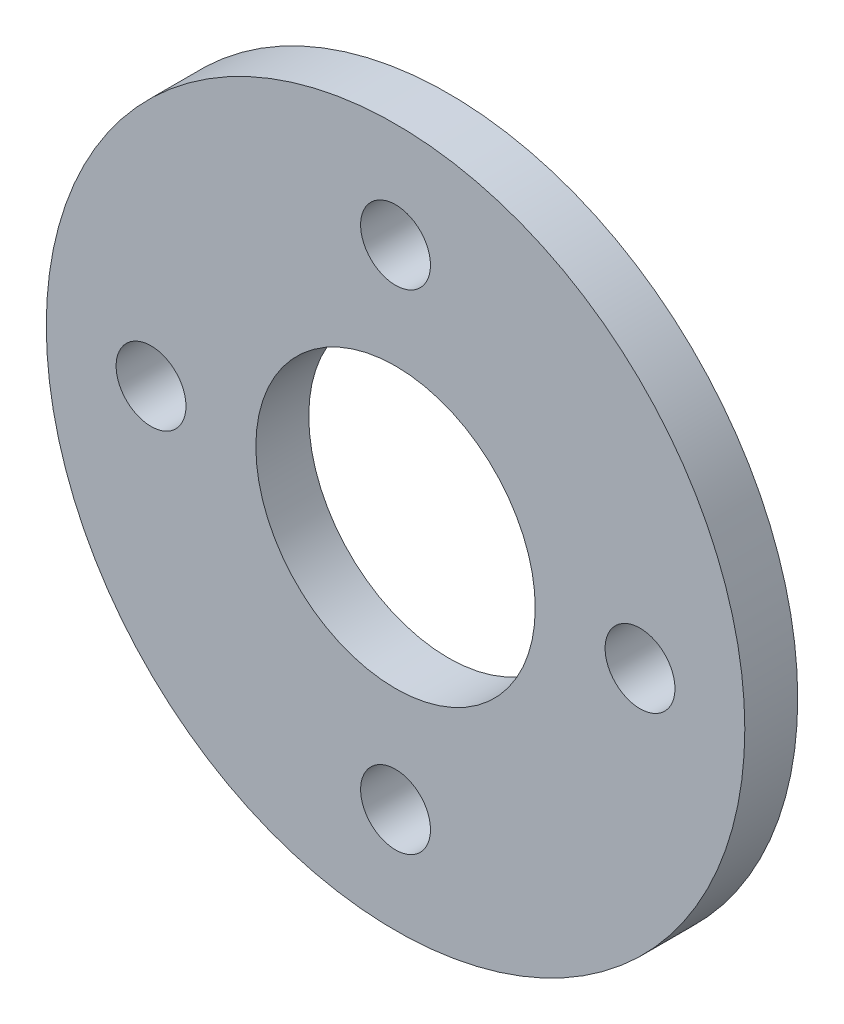
ISO-10303-21;
HEADER;
FILE_DESCRIPTION(('STEP AP214'),'2;1');
FILE_NAME('part.step','',(''),(''),'','','');
FILE_SCHEMA(('AUTOMOTIVE_DESIGN { 1 0 10303 214 1 1 1 1 }'));
ENDSEC;
DATA;
#1=APPLICATION_CONTEXT('core data for automotive mechanical design processes');
#2=APPLICATION_PROTOCOL_DEFINITION('international standard','automotive_design',2000,#1);
#3=PRODUCT_CONTEXT('',#1,'mechanical');
#4=PRODUCT('Part','Part','',(#3));
#5=PRODUCT_RELATED_PRODUCT_CATEGORY('part','',(#4));
#6=PRODUCT_DEFINITION_FORMATION('','',#4);
#7=PRODUCT_DEFINITION_CONTEXT('part definition',#1,'design');
#8=PRODUCT_DEFINITION('design','',#6,#7);
#9=PRODUCT_DEFINITION_SHAPE('','',#8);
#10=(LENGTH_UNIT() NAMED_UNIT(*) SI_UNIT(.MILLI.,.METRE.));
#11=(NAMED_UNIT(*) PLANE_ANGLE_UNIT() SI_UNIT($,.RADIAN.));
#12=(NAMED_UNIT(*) SI_UNIT($,.STERADIAN.) SOLID_ANGLE_UNIT());
#13=UNCERTAINTY_MEASURE_WITH_UNIT(LENGTH_MEASURE(1.E-05),#10,'distance_accuracy_value','');
#14=(GEOMETRIC_REPRESENTATION_CONTEXT(3) GLOBAL_UNCERTAINTY_ASSIGNED_CONTEXT((#13)) GLOBAL_UNIT_ASSIGNED_CONTEXT((#10,
#11,#12)) REPRESENTATION_CONTEXT('',''));
#15=CARTESIAN_POINT('',(0.,0.,0.));
#16=DIRECTION('',(0.,0.,1.));
#17=DIRECTION('',(1.,0.,0.));
#18=AXIS2_PLACEMENT_3D('',#15,#16,#17);
#19=CARTESIAN_POINT('',(0.,0.,1.515));
#20=DIRECTION('',(0.,0.,1.));
#21=DIRECTION('',(1.,0.,0.));
#22=AXIS2_PLACEMENT_3D('',#19,#20,#21);
#23=PLANE('',#22);
#24=CARTESIAN_POINT('',(7.,0.,1.515));
#25=DIRECTION('',(0.,0.,1.));
#26=DIRECTION('',(1.,0.,0.));
#27=AXIS2_PLACEMENT_3D('',#24,#25,#26);
#28=CIRCLE('',#27,0.999999999999999);
#29=CARTESIAN_POINT('',(8.,0.,1.515));
#30=VERTEX_POINT('',#29);
#31=EDGE_CURVE('E72',#30,#30,#28,.T.);
#32=ORIENTED_EDGE('',*,*,#31,.F.);
#33=EDGE_LOOP('',(#32));
#34=FACE_BOUND('',#33,.T.);
#35=CARTESIAN_POINT('',(-7.,0.,1.515));
#36=DIRECTION('',(0.,0.,1.));
#37=DIRECTION('',(1.,0.,0.));
#38=AXIS2_PLACEMENT_3D('',#35,#36,#37);
#39=CIRCLE('',#38,1.);
#40=CARTESIAN_POINT('',(-6.,0.,1.515));
#41=VERTEX_POINT('',#40);
#42=EDGE_CURVE('E56',#41,#41,#39,.T.);
#43=ORIENTED_EDGE('',*,*,#42,.F.);
#44=EDGE_LOOP('',(#43));
#45=FACE_BOUND('',#44,.T.);
#46=CARTESIAN_POINT('',(0.,0.,1.515));
#47=DIRECTION('',(0.,0.,1.));
#48=DIRECTION('',(1.,0.,0.));
#49=AXIS2_PLACEMENT_3D('',#46,#47,#48);
#50=CIRCLE('',#49,10.);
#51=CARTESIAN_POINT('',(10.,0.,1.515));
#52=VERTEX_POINT('',#51);
#53=EDGE_CURVE('E10',#52,#52,#50,.T.);
#54=ORIENTED_EDGE('',*,*,#53,.T.);
#55=EDGE_LOOP('',(#54));
#56=FACE_BOUND('',#55,.T.);
#57=CARTESIAN_POINT('',(0.,0.,1.515));
#58=DIRECTION('',(0.,0.,1.));
#59=DIRECTION('',(1.,0.,0.));
#60=AXIS2_PLACEMENT_3D('',#57,#58,#59);
#61=CIRCLE('',#60,4.);
#62=CARTESIAN_POINT('',(4.,0.,1.515));
#63=VERTEX_POINT('',#62);
#64=EDGE_CURVE('E50',#63,#63,#61,.T.);
#65=ORIENTED_EDGE('',*,*,#64,.F.);
#66=EDGE_LOOP('',(#65));
#67=FACE_BOUND('',#66,.T.);
#68=CARTESIAN_POINT('',(0.,7.,1.515));
#69=DIRECTION('',(0.,0.,1.));
#70=DIRECTION('',(1.,0.,0.));
#71=AXIS2_PLACEMENT_3D('',#68,#69,#70);
#72=CIRCLE('',#71,1.);
#73=CARTESIAN_POINT('',(1.00000000000002,7.,1.515));
#74=VERTEX_POINT('',#73);
#75=EDGE_CURVE('E64',#74,#74,#72,.T.);
#76=ORIENTED_EDGE('',*,*,#75,.F.);
#77=EDGE_LOOP('',(#76));
#78=FACE_BOUND('',#77,.T.);
#79=CARTESIAN_POINT('',(0.,-7.,1.515));
#80=DIRECTION('',(0.,0.,1.));
#81=DIRECTION('',(1.,0.,0.));
#82=AXIS2_PLACEMENT_3D('',#79,#80,#81);
#83=CIRCLE('',#82,1.);
#84=CARTESIAN_POINT('',(0.999999999999927,-7.,1.515));
#85=VERTEX_POINT('',#84);
#86=EDGE_CURVE('E80',#85,#85,#83,.T.);
#87=ORIENTED_EDGE('',*,*,#86,.F.);
#88=EDGE_LOOP('',(#87));
#89=FACE_BOUND('',#88,.T.);
#90=ADVANCED_FACE('F37',(#34,#45,#56,#67,#78,#89),#23,.T.);
#91=CARTESIAN_POINT('',(0.,0.,0.));
#92=DIRECTION('',(0.,0.,1.));
#93=DIRECTION('',(1.,0.,0.));
#94=AXIS2_PLACEMENT_3D('',#91,#92,#93);
#95=PLANE('',#94);
#96=CARTESIAN_POINT('',(0.,0.,0.));
#97=DIRECTION('',(0.,0.,1.));
#98=DIRECTION('',(1.,0.,0.));
#99=AXIS2_PLACEMENT_3D('',#96,#97,#98);
#100=CIRCLE('',#99,10.);
#101=CARTESIAN_POINT('',(10.,0.,0.));
#102=VERTEX_POINT('',#101);
#103=EDGE_CURVE('E41',#102,#102,#100,.T.);
#104=ORIENTED_EDGE('',*,*,#103,.F.);
#105=EDGE_LOOP('',(#104));
#106=FACE_BOUND('',#105,.T.);
#107=CARTESIAN_POINT('',(0.,0.,0.));
#108=DIRECTION('',(0.,0.,1.));
#109=DIRECTION('',(1.,0.,0.));
#110=AXIS2_PLACEMENT_3D('',#107,#108,#109);
#111=CIRCLE('',#110,4.);
#112=CARTESIAN_POINT('',(4.,0.,0.));
#113=VERTEX_POINT('',#112);
#114=EDGE_CURVE('E52',#113,#113,#111,.T.);
#115=ORIENTED_EDGE('',*,*,#114,.T.);
#116=EDGE_LOOP('',(#115));
#117=FACE_BOUND('',#116,.T.);
#118=CARTESIAN_POINT('',(-7.,0.,0.));
#119=DIRECTION('',(0.,0.,1.));
#120=DIRECTION('',(1.,0.,0.));
#121=AXIS2_PLACEMENT_3D('',#118,#119,#120);
#122=CIRCLE('',#121,1.);
#123=CARTESIAN_POINT('',(-6.,0.,0.));
#124=VERTEX_POINT('',#123);
#125=EDGE_CURVE('E60',#124,#124,#122,.T.);
#126=ORIENTED_EDGE('',*,*,#125,.T.);
#127=EDGE_LOOP('',(#126));
#128=FACE_BOUND('',#127,.T.);
#129=CARTESIAN_POINT('',(0.,7.,0.));
#130=DIRECTION('',(0.,0.,1.));
#131=DIRECTION('',(1.,0.,0.));
#132=AXIS2_PLACEMENT_3D('',#129,#130,#131);
#133=CIRCLE('',#132,1.);
#134=CARTESIAN_POINT('',(1.00000000000002,7.,0.));
#135=VERTEX_POINT('',#134);
#136=EDGE_CURVE('E68',#135,#135,#133,.T.);
#137=ORIENTED_EDGE('',*,*,#136,.T.);
#138=EDGE_LOOP('',(#137));
#139=FACE_BOUND('',#138,.T.);
#140=CARTESIAN_POINT('',(7.,0.,0.));
#141=DIRECTION('',(0.,0.,1.));
#142=DIRECTION('',(1.,0.,0.));
#143=AXIS2_PLACEMENT_3D('',#140,#141,#142);
#144=CIRCLE('',#143,0.999999999999999);
#145=CARTESIAN_POINT('',(8.,0.,0.));
#146=VERTEX_POINT('',#145);
#147=EDGE_CURVE('E76',#146,#146,#144,.T.);
#148=ORIENTED_EDGE('',*,*,#147,.T.);
#149=EDGE_LOOP('',(#148));
#150=FACE_BOUND('',#149,.T.);
#151=CARTESIAN_POINT('',(0.,-7.,0.));
#152=DIRECTION('',(0.,0.,1.));
#153=DIRECTION('',(1.,0.,0.));
#154=AXIS2_PLACEMENT_3D('',#151,#152,#153);
#155=CIRCLE('',#154,1.);
#156=CARTESIAN_POINT('',(0.999999999999927,-7.,0.));
#157=VERTEX_POINT('',#156);
#158=EDGE_CURVE('E84',#157,#157,#155,.T.);
#159=ORIENTED_EDGE('',*,*,#158,.T.);
#160=EDGE_LOOP('',(#159));
#161=FACE_BOUND('',#160,.T.);
#162=ADVANCED_FACE('F96',(#106,#117,#128,#139,#150,#161),#95,.F.);
#163=CARTESIAN_POINT('',(0.,0.,1.515));
#164=DIRECTION('',(0.,0.,-1.));
#165=DIRECTION('',(-1.,0.,0.));
#166=AXIS2_PLACEMENT_3D('',#163,#164,#165);
#167=CYLINDRICAL_SURFACE('',#166,10.);
#168=ORIENTED_EDGE('',*,*,#53,.F.);
#169=EDGE_LOOP('',(#168));
#170=FACE_BOUND('',#169,.T.);
#171=ORIENTED_EDGE('',*,*,#103,.T.);
#172=EDGE_LOOP('',(#171));
#173=FACE_BOUND('',#172,.T.);
#174=ADVANCED_FACE('F39',(#170,#173),#167,.T.);
#175=CARTESIAN_POINT('',(0.,0.,1.515));
#176=DIRECTION('',(0.,0.,-1.));
#177=DIRECTION('',(-1.,0.,0.));
#178=AXIS2_PLACEMENT_3D('',#175,#176,#177);
#179=CYLINDRICAL_SURFACE('',#178,4.);
#180=ORIENTED_EDGE('',*,*,#64,.T.);
#181=EDGE_LOOP('',(#180));
#182=FACE_BOUND('',#181,.T.);
#183=ORIENTED_EDGE('',*,*,#114,.F.);
#184=EDGE_LOOP('',(#183));
#185=FACE_BOUND('',#184,.T.);
#186=ADVANCED_FACE('F106',(#182,#185),#179,.F.);
#187=CARTESIAN_POINT('',(-7.,0.,1.515));
#188=DIRECTION('',(0.,0.,-1.));
#189=DIRECTION('',(-1.,0.,0.));
#190=AXIS2_PLACEMENT_3D('',#187,#188,#189);
#191=CYLINDRICAL_SURFACE('',#190,1.);
#192=ORIENTED_EDGE('',*,*,#42,.T.);
#193=EDGE_LOOP('',(#192));
#194=FACE_BOUND('',#193,.T.);
#195=ORIENTED_EDGE('',*,*,#125,.F.);
#196=EDGE_LOOP('',(#195));
#197=FACE_BOUND('',#196,.T.);
#198=ADVANCED_FACE('F109',(#194,#197),#191,.F.);
#199=CARTESIAN_POINT('',(0.,7.,1.515));
#200=DIRECTION('',(0.,0.,-1.));
#201=DIRECTION('',(-1.,0.,0.));
#202=AXIS2_PLACEMENT_3D('',#199,#200,#201);
#203=CYLINDRICAL_SURFACE('',#202,1.);
#204=ORIENTED_EDGE('',*,*,#75,.T.);
#205=EDGE_LOOP('',(#204));
#206=FACE_BOUND('',#205,.T.);
#207=ORIENTED_EDGE('',*,*,#136,.F.);
#208=EDGE_LOOP('',(#207));
#209=FACE_BOUND('',#208,.T.);
#210=ADVANCED_FACE('F113',(#206,#209),#203,.F.);
#211=CARTESIAN_POINT('',(7.,0.,1.515));
#212=DIRECTION('',(0.,0.,-1.));
#213=DIRECTION('',(-1.,0.,0.));
#214=AXIS2_PLACEMENT_3D('',#211,#212,#213);
#215=CYLINDRICAL_SURFACE('',#214,0.999999999999999);
#216=ORIENTED_EDGE('',*,*,#31,.T.);
#217=EDGE_LOOP('',(#216));
#218=FACE_BOUND('',#217,.T.);
#219=ORIENTED_EDGE('',*,*,#147,.F.);
#220=EDGE_LOOP('',(#219));
#221=FACE_BOUND('',#220,.T.);
#222=ADVANCED_FACE('F117',(#218,#221),#215,.F.);
#223=CARTESIAN_POINT('',(0.,-7.,1.515));
#224=DIRECTION('',(0.,0.,-1.));
#225=DIRECTION('',(-1.,0.,0.));
#226=AXIS2_PLACEMENT_3D('',#223,#224,#225);
#227=CYLINDRICAL_SURFACE('',#226,1.);
#228=ORIENTED_EDGE('',*,*,#86,.T.);
#229=EDGE_LOOP('',(#228));
#230=FACE_BOUND('',#229,.T.);
#231=ORIENTED_EDGE('',*,*,#158,.F.);
#232=EDGE_LOOP('',(#231));
#233=FACE_BOUND('',#232,.T.);
#234=ADVANCED_FACE('F92',(#230,#233),#227,.F.);
#235=CLOSED_SHELL('',(#90,#162,#174,#186,#198,#210,#222,#234));
#236=MANIFOLD_SOLID_BREP('B2',#235);
#237=ADVANCED_BREP_SHAPE_REPRESENTATION('',(#18,#236),#14);
#238=SHAPE_DEFINITION_REPRESENTATION(#9,#237);
ENDSEC;
END-ISO-10303-21;
